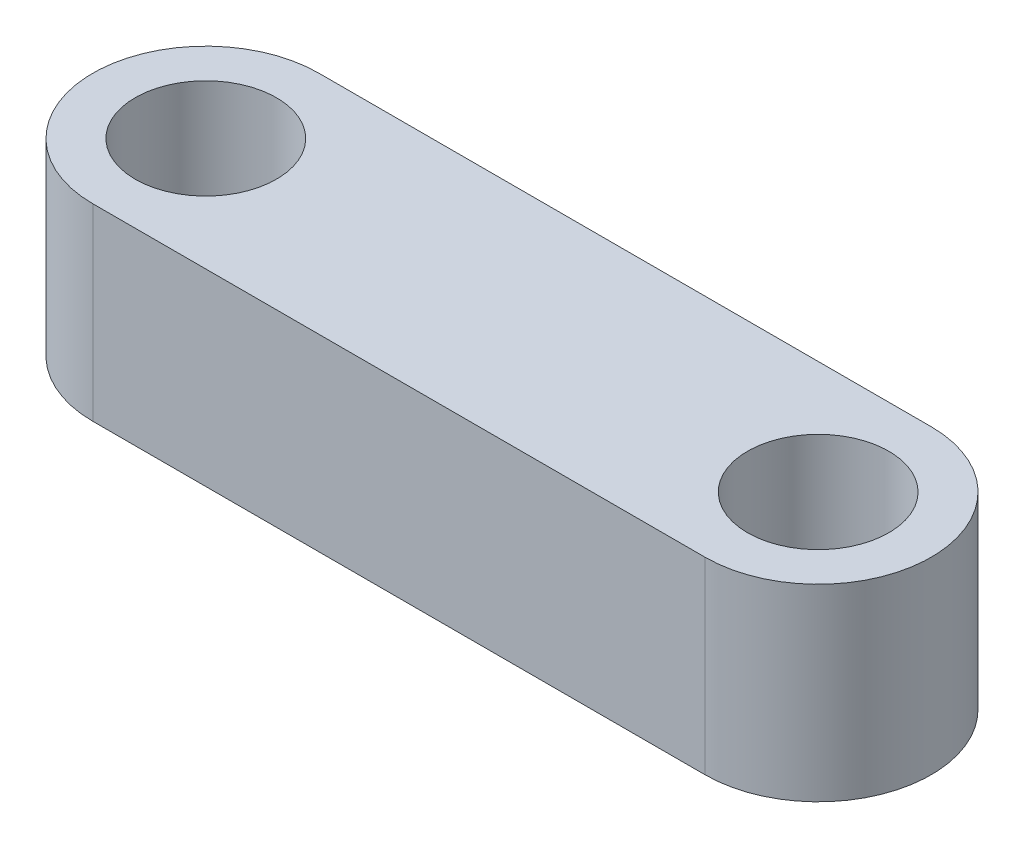
ISO-10303-21;
HEADER;
FILE_DESCRIPTION(('STEP AP214'),'2;1');
FILE_NAME('part.step','',(''),(''),'','','');
FILE_SCHEMA(('AUTOMOTIVE_DESIGN { 1 0 10303 214 1 1 1 1 }'));
ENDSEC;
DATA;
#1=APPLICATION_CONTEXT('core data for automotive mechanical design processes');
#2=APPLICATION_PROTOCOL_DEFINITION('international standard','automotive_design',2000,#1);
#3=PRODUCT_CONTEXT('',#1,'mechanical');
#4=PRODUCT('Part','Part','',(#3));
#5=PRODUCT_RELATED_PRODUCT_CATEGORY('part','',(#4));
#6=PRODUCT_DEFINITION_FORMATION('','',#4);
#7=PRODUCT_DEFINITION_CONTEXT('part definition',#1,'design');
#8=PRODUCT_DEFINITION('design','',#6,#7);
#9=PRODUCT_DEFINITION_SHAPE('','',#8);
#10=(LENGTH_UNIT() NAMED_UNIT(*) SI_UNIT(.MILLI.,.METRE.));
#11=(NAMED_UNIT(*) PLANE_ANGLE_UNIT() SI_UNIT($,.RADIAN.));
#12=(NAMED_UNIT(*) SI_UNIT($,.STERADIAN.) SOLID_ANGLE_UNIT());
#13=UNCERTAINTY_MEASURE_WITH_UNIT(LENGTH_MEASURE(1.E-05),#10,'distance_accuracy_value','');
#14=(GEOMETRIC_REPRESENTATION_CONTEXT(3) GLOBAL_UNCERTAINTY_ASSIGNED_CONTEXT((#13)) GLOBAL_UNIT_ASSIGNED_CONTEXT((#10,
#11,#12)) REPRESENTATION_CONTEXT('',''));
#15=CARTESIAN_POINT('',(0.,0.,0.));
#16=DIRECTION('',(0.,0.,1.));
#17=DIRECTION('',(1.,0.,0.));
#18=AXIS2_PLACEMENT_3D('',#15,#16,#17);
#19=CARTESIAN_POINT('',(-29.8352514722545,3.175,-4.02945363236052));
#20=DIRECTION('',(0.,1.,0.));
#21=DIRECTION('',(0.,0.,1.));
#22=AXIS2_PLACEMENT_3D('',#19,#20,#21);
#23=PLANE('',#22);
#24=CARTESIAN_POINT('',(-29.8352514722545,3.175,-4.02945363236052));
#25=DIRECTION('',(0.,1.,0.));
#26=DIRECTION('',(0.,0.,1.));
#27=AXIS2_PLACEMENT_3D('',#24,#25,#26);
#28=CIRCLE('',#27,1.190625);
#29=CARTESIAN_POINT('',(-29.8352514722545,3.175,-2.83882863236052));
#30=VERTEX_POINT('',#29);
#31=EDGE_CURVE('E104',#30,#30,#28,.T.);
#32=ORIENTED_EDGE('',*,*,#31,.F.);
#33=EDGE_LOOP('',(#32));
#34=FACE_BOUND('',#33,.T.);
#35=CARTESIAN_POINT('',(-29.8352514722545,3.175,-4.02945363236052));
#36=DIRECTION('',(0.,1.,0.));
#37=DIRECTION('',(0.,0.,1.));
#38=AXIS2_PLACEMENT_3D('',#35,#36,#37);
#39=CIRCLE('',#38,1.905);
#40=CARTESIAN_POINT('',(-29.8352514722545,3.175,-5.93445363236052));
#41=VERTEX_POINT('',#40);
#42=CARTESIAN_POINT('',(-29.8352514722545,3.175,-2.12445363236052));
#43=VERTEX_POINT('',#42);
#44=EDGE_CURVE('E89',#41,#43,#39,.T.);
#45=ORIENTED_EDGE('',*,*,#44,.T.);
#46=DIRECTION('',(1.,0.,0.));
#47=VECTOR('',#46,1.);
#48=CARTESIAN_POINT('',(-29.8352514722545,3.175,-2.12445363236052));
#49=LINE('',#48,#47);
#50=CARTESIAN_POINT('',(-19.5165014722545,3.175,-2.12445363236052));
#51=VERTEX_POINT('',#50);
#52=EDGE_CURVE('E84',#43,#51,#49,.T.);
#53=ORIENTED_EDGE('',*,*,#52,.T.);
#54=CARTESIAN_POINT('',(-19.5165014722545,3.175,-4.02945363236052));
#55=DIRECTION('',(0.,1.,0.));
#56=DIRECTION('',(0.,0.,1.));
#57=AXIS2_PLACEMENT_3D('',#54,#55,#56);
#58=CIRCLE('',#57,1.905);
#59=CARTESIAN_POINT('',(-19.5165014722545,3.175,-5.93445363236052));
#60=VERTEX_POINT('',#59);
#61=EDGE_CURVE('E87',#51,#60,#58,.T.);
#62=ORIENTED_EDGE('',*,*,#61,.T.);
#63=DIRECTION('',(-1.,0.,0.));
#64=VECTOR('',#63,1.);
#65=CARTESIAN_POINT('',(-29.8352514722545,3.175,-5.93445363236052));
#66=LINE('',#65,#64);
#67=EDGE_CURVE('E54',#60,#41,#66,.T.);
#68=ORIENTED_EDGE('',*,*,#67,.T.);
#69=EDGE_LOOP('',(#45,#53,#62,#68));
#70=FACE_BOUND('',#69,.T.);
#71=CARTESIAN_POINT('',(-19.5165014722545,3.175,-4.02945363236052));
#72=DIRECTION('',(0.,1.,0.));
#73=DIRECTION('',(0.,0.,1.));
#74=AXIS2_PLACEMENT_3D('',#71,#72,#73);
#75=CIRCLE('',#74,1.190625);
#76=CARTESIAN_POINT('',(-19.5165014722545,3.175,-2.83882863236052));
#77=VERTEX_POINT('',#76);
#78=EDGE_CURVE('E119',#77,#77,#75,.T.);
#79=ORIENTED_EDGE('',*,*,#78,.F.);
#80=EDGE_LOOP('',(#79));
#81=FACE_BOUND('',#80,.T.);
#82=ADVANCED_FACE('F37',(#34,#70,#81),#23,.T.);
#83=CARTESIAN_POINT('',(-29.8352514722545,0.,-4.02945363236052));
#84=DIRECTION('',(0.,1.,0.));
#85=DIRECTION('',(0.,0.,1.));
#86=AXIS2_PLACEMENT_3D('',#83,#84,#85);
#87=PLANE('',#86);
#88=CARTESIAN_POINT('',(-29.8352514722545,0.,-4.02945363236052));
#89=DIRECTION('',(0.,1.,0.));
#90=DIRECTION('',(0.,0.,1.));
#91=AXIS2_PLACEMENT_3D('',#88,#89,#90);
#92=CIRCLE('',#91,1.905);
#93=CARTESIAN_POINT('',(-29.8352514722545,0.,-5.93445363236052));
#94=VERTEX_POINT('',#93);
#95=CARTESIAN_POINT('',(-29.8352514722545,0.,-2.12445363236052));
#96=VERTEX_POINT('',#95);
#97=EDGE_CURVE('E101',#94,#96,#92,.T.);
#98=ORIENTED_EDGE('',*,*,#97,.F.);
#99=DIRECTION('',(-1.,0.,0.));
#100=VECTOR('',#99,1.);
#101=CARTESIAN_POINT('',(-29.8352514722545,0.,-5.93445363236052));
#102=LINE('',#101,#100);
#103=CARTESIAN_POINT('',(-19.5165014722545,0.,-5.93445363236052));
#104=VERTEX_POINT('',#103);
#105=EDGE_CURVE('E77',#104,#94,#102,.T.);
#106=ORIENTED_EDGE('',*,*,#105,.F.);
#107=CARTESIAN_POINT('',(-19.5165014722545,0.,-4.02945363236052));
#108=DIRECTION('',(0.,1.,0.));
#109=DIRECTION('',(0.,0.,1.));
#110=AXIS2_PLACEMENT_3D('',#107,#108,#109);
#111=CIRCLE('',#110,1.905);
#112=CARTESIAN_POINT('',(-19.5165014722545,0.,-2.12445363236052));
#113=VERTEX_POINT('',#112);
#114=EDGE_CURVE('E71',#113,#104,#111,.T.);
#115=ORIENTED_EDGE('',*,*,#114,.F.);
#116=DIRECTION('',(1.,0.,0.));
#117=VECTOR('',#116,1.);
#118=CARTESIAN_POINT('',(-29.8352514722545,0.,-2.12445363236052));
#119=LINE('',#118,#117);
#120=EDGE_CURVE('E93',#96,#113,#119,.T.);
#121=ORIENTED_EDGE('',*,*,#120,.F.);
#122=EDGE_LOOP('',(#98,#106,#115,#121));
#123=FACE_BOUND('',#122,.T.);
#124=CARTESIAN_POINT('',(-29.8352514722545,0.,-4.02945363236052));
#125=DIRECTION('',(0.,1.,0.));
#126=DIRECTION('',(0.,0.,1.));
#127=AXIS2_PLACEMENT_3D('',#124,#125,#126);
#128=CIRCLE('',#127,1.190625);
#129=CARTESIAN_POINT('',(-29.8352514722545,0.,-2.83882863236052));
#130=VERTEX_POINT('',#129);
#131=EDGE_CURVE('E116',#130,#130,#128,.T.);
#132=ORIENTED_EDGE('',*,*,#131,.T.);
#133=EDGE_LOOP('',(#132));
#134=FACE_BOUND('',#133,.T.);
#135=CARTESIAN_POINT('',(-19.5165014722545,0.,-4.02945363236052));
#136=DIRECTION('',(0.,1.,0.));
#137=DIRECTION('',(0.,0.,1.));
#138=AXIS2_PLACEMENT_3D('',#135,#136,#137);
#139=CIRCLE('',#138,1.190625);
#140=CARTESIAN_POINT('',(-19.5165014722545,0.,-2.83882863236052));
#141=VERTEX_POINT('',#140);
#142=EDGE_CURVE('E122',#141,#141,#139,.T.);
#143=ORIENTED_EDGE('',*,*,#142,.T.);
#144=EDGE_LOOP('',(#143));
#145=FACE_BOUND('',#144,.T.);
#146=ADVANCED_FACE('F112',(#123,#134,#145),#87,.F.);
#147=CARTESIAN_POINT('',(-29.8352514722545,3.175,-4.02945363236052));
#148=DIRECTION('',(0.,-1.,0.));
#149=DIRECTION('',(0.,0.,-1.));
#150=AXIS2_PLACEMENT_3D('',#147,#148,#149);
#151=CYLINDRICAL_SURFACE('',#150,1.905);
#152=ORIENTED_EDGE('',*,*,#97,.T.);
#153=DIRECTION('',(0.,-1.,0.));
#154=VECTOR('',#153,1.);
#155=CARTESIAN_POINT('',(-29.8352514722545,3.175,-2.12445363236052));
#156=LINE('',#155,#154);
#157=EDGE_CURVE('E11',#43,#96,#156,.T.);
#158=ORIENTED_EDGE('',*,*,#157,.F.);
#159=ORIENTED_EDGE('',*,*,#44,.F.);
#160=DIRECTION('',(0.,-1.,0.));
#161=VECTOR('',#160,1.);
#162=CARTESIAN_POINT('',(-29.8352514722545,3.175,-5.93445363236052));
#163=LINE('',#162,#161);
#164=EDGE_CURVE('E97',#41,#94,#163,.T.);
#165=ORIENTED_EDGE('',*,*,#164,.T.);
#166=EDGE_LOOP('',(#152,#158,#159,#165));
#167=FACE_BOUND('',#166,.T.);
#168=ADVANCED_FACE('F39',(#167),#151,.T.);
#169=CARTESIAN_POINT('',(-29.8352514722545,3.175,-2.12445363236052));
#170=DIRECTION('',(0.,0.,-1.));
#171=DIRECTION('',(-1.,0.,0.));
#172=AXIS2_PLACEMENT_3D('',#169,#170,#171);
#173=PLANE('',#172);
#174=ORIENTED_EDGE('',*,*,#120,.T.);
#175=DIRECTION('',(0.,-1.,0.));
#176=VECTOR('',#175,1.);
#177=CARTESIAN_POINT('',(-19.5165014722545,3.175,-2.12445363236052));
#178=LINE('',#177,#176);
#179=EDGE_CURVE('E46',#51,#113,#178,.T.);
#180=ORIENTED_EDGE('',*,*,#179,.F.);
#181=ORIENTED_EDGE('',*,*,#52,.F.);
#182=ORIENTED_EDGE('',*,*,#157,.T.);
#183=EDGE_LOOP('',(#174,#180,#181,#182));
#184=FACE_BOUND('',#183,.T.);
#185=ADVANCED_FACE('F92',(#184),#173,.F.);
#186=CARTESIAN_POINT('',(-19.5165014722545,3.175,-4.02945363236052));
#187=DIRECTION('',(0.,-1.,0.));
#188=DIRECTION('',(0.,0.,-1.));
#189=AXIS2_PLACEMENT_3D('',#186,#187,#188);
#190=CYLINDRICAL_SURFACE('',#189,1.905);
#191=ORIENTED_EDGE('',*,*,#114,.T.);
#192=DIRECTION('',(0.,-1.,0.));
#193=VECTOR('',#192,1.);
#194=CARTESIAN_POINT('',(-19.5165014722545,3.175,-5.93445363236052));
#195=LINE('',#194,#193);
#196=EDGE_CURVE('E94',#60,#104,#195,.T.);
#197=ORIENTED_EDGE('',*,*,#196,.F.);
#198=ORIENTED_EDGE('',*,*,#61,.F.);
#199=ORIENTED_EDGE('',*,*,#179,.T.);
#200=EDGE_LOOP('',(#191,#197,#198,#199));
#201=FACE_BOUND('',#200,.T.);
#202=ADVANCED_FACE('F95',(#201),#190,.T.);
#203=CARTESIAN_POINT('',(-29.8352514722545,3.175,-5.93445363236052));
#204=DIRECTION('',(0.,0.,1.));
#205=DIRECTION('',(1.,0.,0.));
#206=AXIS2_PLACEMENT_3D('',#203,#204,#205);
#207=PLANE('',#206);
#208=ORIENTED_EDGE('',*,*,#105,.T.);
#209=ORIENTED_EDGE('',*,*,#164,.F.);
#210=ORIENTED_EDGE('',*,*,#67,.F.);
#211=ORIENTED_EDGE('',*,*,#196,.T.);
#212=EDGE_LOOP('',(#208,#209,#210,#211));
#213=FACE_BOUND('',#212,.T.);
#214=ADVANCED_FACE('F109',(#213),#207,.F.);
#215=CARTESIAN_POINT('',(-29.8352514722545,3.175,-4.02945363236052));
#216=DIRECTION('',(0.,-1.,0.));
#217=DIRECTION('',(0.,0.,-1.));
#218=AXIS2_PLACEMENT_3D('',#215,#216,#217);
#219=CYLINDRICAL_SURFACE('',#218,1.190625);
#220=ORIENTED_EDGE('',*,*,#31,.T.);
#221=EDGE_LOOP('',(#220));
#222=FACE_BOUND('',#221,.T.);
#223=ORIENTED_EDGE('',*,*,#131,.F.);
#224=EDGE_LOOP('',(#223));
#225=FACE_BOUND('',#224,.T.);
#226=ADVANCED_FACE('F139',(#222,#225),#219,.F.);
#227=CARTESIAN_POINT('',(-19.5165014722545,3.175,-4.02945363236052));
#228=DIRECTION('',(0.,-1.,0.));
#229=DIRECTION('',(0.,0.,-1.));
#230=AXIS2_PLACEMENT_3D('',#227,#228,#229);
#231=CYLINDRICAL_SURFACE('',#230,1.190625);
#232=ORIENTED_EDGE('',*,*,#78,.T.);
#233=EDGE_LOOP('',(#232));
#234=FACE_BOUND('',#233,.T.);
#235=ORIENTED_EDGE('',*,*,#142,.F.);
#236=EDGE_LOOP('',(#235));
#237=FACE_BOUND('',#236,.T.);
#238=ADVANCED_FACE('F128',(#234,#237),#231,.F.);
#239=CLOSED_SHELL('',(#82,#146,#168,#185,#202,#214,#226,#238));
#240=MANIFOLD_SOLID_BREP('B2',#239);
#241=ADVANCED_BREP_SHAPE_REPRESENTATION('',(#18,#240),#14);
#242=SHAPE_DEFINITION_REPRESENTATION(#9,#241);
ENDSEC;
END-ISO-10303-21;
